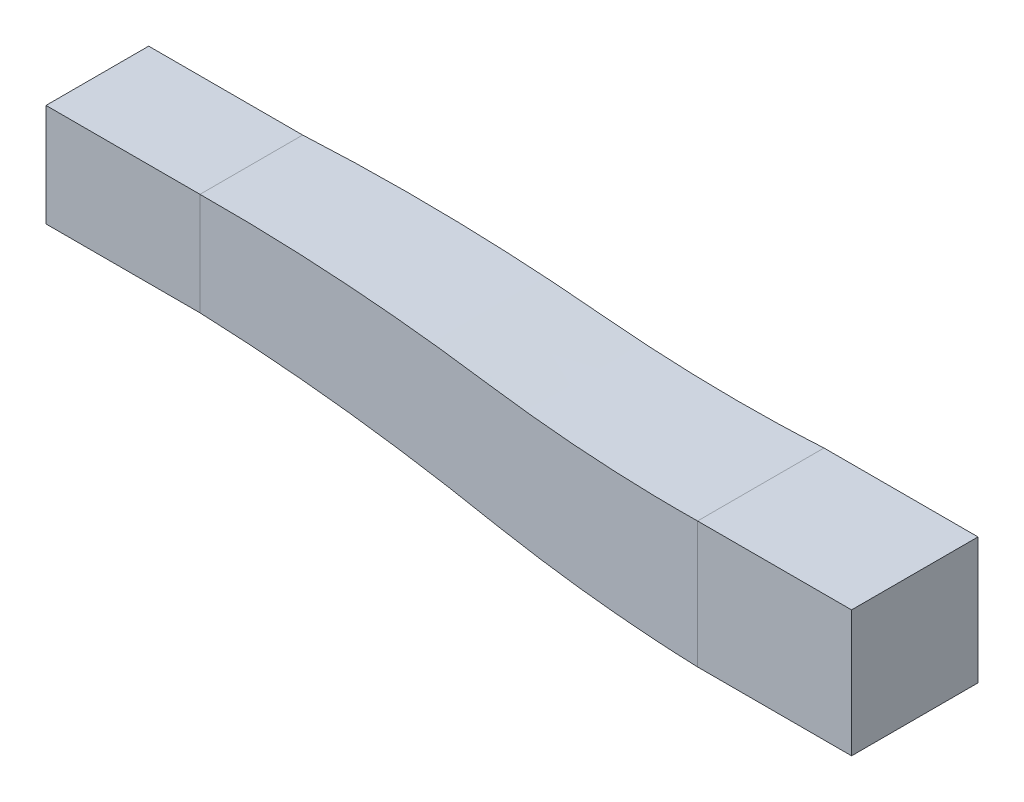
ISO-10303-21;
HEADER;
FILE_DESCRIPTION(('STEP AP214'),'2;1');
FILE_NAME('part.step','',(''),(''),'','','');
FILE_SCHEMA(('AUTOMOTIVE_DESIGN { 1 0 10303 214 1 1 1 1 }'));
ENDSEC;
DATA;
#1=APPLICATION_CONTEXT('core data for automotive mechanical design processes');
#2=APPLICATION_PROTOCOL_DEFINITION('international standard','automotive_design',2000,#1);
#3=PRODUCT_CONTEXT('',#1,'mechanical');
#4=PRODUCT('Part','Part','',(#3));
#5=PRODUCT_RELATED_PRODUCT_CATEGORY('part','',(#4));
#6=PRODUCT_DEFINITION_FORMATION('','',#4);
#7=PRODUCT_DEFINITION_CONTEXT('part definition',#1,'design');
#8=PRODUCT_DEFINITION('design','',#6,#7);
#9=PRODUCT_DEFINITION_SHAPE('','',#8);
#10=(LENGTH_UNIT() NAMED_UNIT(*) SI_UNIT(.MILLI.,.METRE.));
#11=(NAMED_UNIT(*) PLANE_ANGLE_UNIT() SI_UNIT($,.RADIAN.));
#12=(NAMED_UNIT(*) SI_UNIT($,.STERADIAN.) SOLID_ANGLE_UNIT());
#13=UNCERTAINTY_MEASURE_WITH_UNIT(LENGTH_MEASURE(1.E-05),#10,'distance_accuracy_value','');
#14=(GEOMETRIC_REPRESENTATION_CONTEXT(3) GLOBAL_UNCERTAINTY_ASSIGNED_CONTEXT((#13)) GLOBAL_UNIT_ASSIGNED_CONTEXT((#10,
#11,#12)) REPRESENTATION_CONTEXT('',''));
#15=CARTESIAN_POINT('',(0.,0.,0.));
#16=DIRECTION('',(0.,0.,1.));
#17=DIRECTION('',(1.,0.,0.));
#18=AXIS2_PLACEMENT_3D('',#15,#16,#17);
#19=CARTESIAN_POINT('',(0.,102.108,-102.108));
#20=CARTESIAN_POINT('',(193.877836208573,108.126077032337,-106.618479591121));
#21=CARTESIAN_POINT('',(387.852255577892,99.4678581753207,-111.128959182242));
#22=CARTESIAN_POINT('',(724.025214907135,58.8494170592293,-119.002959182242));
#23=CARTESIAN_POINT('',(868.712821410133,52.7250903488197,-122.366479591121));
#24=CARTESIAN_POINT('',(1013.26771114708,57.8788888677979,-125.73));
#25=CARTESIAN_POINT('',(0.,102.108,-93.599));
#26=CARTESIAN_POINT('',(193.877836208573,108.126077032337,-97.733606291861));
#27=CARTESIAN_POINT('',(387.852255577892,99.4678581753207,-101.868212583722));
#28=CARTESIAN_POINT('',(724.025214907135,58.8494170592293,-109.086045917055));
#29=CARTESIAN_POINT('',(868.712821410133,52.7250903488197,-112.169272958528));
#30=CARTESIAN_POINT('',(1013.26771114708,57.8788888677979,-115.2525));
#31=CARTESIAN_POINT('',(0.,102.108,-76.581));
#32=CARTESIAN_POINT('',(193.877836208574,108.126077032337,-79.9638596933409));
#33=CARTESIAN_POINT('',(387.852255577893,99.4678581753207,-83.3467193866817));
#34=CARTESIAN_POINT('',(724.025214907136,58.8494170592293,-89.2522193866817));
#35=CARTESIAN_POINT('',(868.712821410134,52.7250903488197,-91.7748596933409));
#36=CARTESIAN_POINT('',(1013.26771114708,57.8788888677979,-94.2975));
#37=CARTESIAN_POINT('',(0.,102.108,-51.054));
#38=CARTESIAN_POINT('',(193.877836208573,108.126077032337,-53.3092397955606));
#39=CARTESIAN_POINT('',(387.852255577891,99.4678581753207,-55.5644795911211));
#40=CARTESIAN_POINT('',(724.025214907134,58.8494170592293,-59.5014795911212));
#41=CARTESIAN_POINT('',(868.712821410132,52.7250903488196,-61.1832397955606));
#42=CARTESIAN_POINT('',(1013.26771114708,57.8788888677978,-62.865));
#43=CARTESIAN_POINT('',(0.,102.108,-25.527));
#44=CARTESIAN_POINT('',(193.877836208573,108.126077032337,-26.6546198977803));
#45=CARTESIAN_POINT('',(387.852255577892,99.4678581753206,-27.7822397955606));
#46=CARTESIAN_POINT('',(724.025214907135,58.8494170592293,-29.7507397955606));
#47=CARTESIAN_POINT('',(868.712821410134,52.7250903488197,-30.5916198977803));
#48=CARTESIAN_POINT('',(1013.26771114708,57.8788888677979,-31.4325));
#49=CARTESIAN_POINT('',(0.,102.108,-8.509));
#50=CARTESIAN_POINT('',(193.877836208573,108.126077032337,-8.88487329926009));
#51=CARTESIAN_POINT('',(387.852255577892,99.4678581753207,-9.26074659852019));
#52=CARTESIAN_POINT('',(724.025214907135,58.8494170592293,-9.91691326518686));
#53=CARTESIAN_POINT('',(868.712821410133,52.7250903488197,-10.1972066325934));
#54=CARTESIAN_POINT('',(1013.26771114708,57.8788888677979,-10.4775));
#55=CARTESIAN_POINT('',(0.,102.108,8.509));
#56=CARTESIAN_POINT('',(193.877836208573,108.126077032337,8.88487329926009));
#57=CARTESIAN_POINT('',(387.852255577892,99.4678581753207,9.26074659852019));
#58=CARTESIAN_POINT('',(724.025214907135,58.8494170592293,9.91691326518686));
#59=CARTESIAN_POINT('',(868.712821410133,52.7250903488197,10.1972066325934));
#60=CARTESIAN_POINT('',(1013.26771114708,57.8788888677979,10.4775));
#61=CARTESIAN_POINT('',(0.,102.108,25.5270000000001));
#62=CARTESIAN_POINT('',(193.877836208573,108.126077032337,26.6546198977803));
#63=CARTESIAN_POINT('',(387.852255577892,99.4678581753207,27.7822397955606));
#64=CARTESIAN_POINT('',(724.025214907135,58.8494170592293,29.7507397955606));
#65=CARTESIAN_POINT('',(868.712821410134,52.7250903488197,30.5916198977803));
#66=CARTESIAN_POINT('',(1013.26771114708,57.8788888677979,31.4325));
#67=CARTESIAN_POINT('',(0.,102.108,51.0539999999999));
#68=CARTESIAN_POINT('',(193.877836208573,108.126077032337,53.3092397955605));
#69=CARTESIAN_POINT('',(387.852255577892,99.4678581753206,55.5644795911211));
#70=CARTESIAN_POINT('',(724.025214907134,58.8494170592292,59.5014795911211));
#71=CARTESIAN_POINT('',(868.712821410133,52.7250903488196,61.1832397955605));
#72=CARTESIAN_POINT('',(1013.26771114708,57.8788888677978,62.865));
#73=CARTESIAN_POINT('',(0.,102.108,76.5810000000001));
#74=CARTESIAN_POINT('',(193.877836208573,108.126077032337,79.9638596933409));
#75=CARTESIAN_POINT('',(387.852255577892,99.4678581753207,83.3467193866818));
#76=CARTESIAN_POINT('',(724.025214907135,58.8494170592293,89.2522193866818));
#77=CARTESIAN_POINT('',(868.712821410133,52.7250903488197,91.7748596933409));
#78=CARTESIAN_POINT('',(1013.26771114708,57.8788888677979,94.2975000000001));
#79=CARTESIAN_POINT('',(0.,102.108,93.599));
#80=CARTESIAN_POINT('',(193.877836208573,108.126077032337,97.733606291861));
#81=CARTESIAN_POINT('',(387.852255577892,99.4678581753206,101.868212583722));
#82=CARTESIAN_POINT('',(724.025214907135,58.8494170592293,109.086045917055));
#83=CARTESIAN_POINT('',(868.712821410133,52.7250903488196,112.169272958528));
#84=CARTESIAN_POINT('',(1013.26771114708,57.8788888677978,115.2525));
#85=CARTESIAN_POINT('',(0.,102.108,102.108));
#86=CARTESIAN_POINT('',(193.877836208573,108.126077032337,106.618479591121));
#87=CARTESIAN_POINT('',(387.852255577892,99.4678581753206,111.128959182242));
#88=CARTESIAN_POINT('',(724.025214907135,58.8494170592293,119.002959182242));
#89=CARTESIAN_POINT('',(868.712821410133,52.7250903488196,122.366479591121));
#90=CARTESIAN_POINT('',(1013.26771114708,57.8788888677978,125.73));
#91=B_SPLINE_SURFACE_WITH_KNOTS('',3,3,((#19,#20,#21,#22,#23,#24),(#25,#26,#27,#28,#29,#30),
(#31,#32,#33,#34,#35,#36),(#37,#38,#39,#40,#41,#42),(#43,#44,#45,#46,#47,#48),(#49,#50,#51,#52,
#53,#54),(#55,#56,#57,#58,#59,#60),(#61,#62,#63,#64,#65,#66),(#67,#68,#69,#70,#71,#72),(#73,#74,
#75,#76,#77,#78),(#79,#80,#81,#82,#83,#84),(#85,#86,#87,#88,#89,#90)),.UNSPECIFIED.,.F.,.F.,.F.,
(4,1,1,1,2,1,1,1,4),(4,2,4),(0.75,0.78125,0.8125,0.84375,0.875,0.90625,0.9375,0.96875,1.),(0.,
0.572832053736493,1.),.UNSPECIFIED.);
#92=DIRECTION('',(0.,0.,1.));
#93=VECTOR('',#92,1.);
#94=CARTESIAN_POINT('',(0.,102.108,102.108));
#95=LINE('',#94,#93);
#96=CARTESIAN_POINT('',(0.,102.108,-102.108));
#97=VERTEX_POINT('',#96);
#98=CARTESIAN_POINT('',(0.,102.108,102.108));
#99=VERTEX_POINT('',#98);
#100=EDGE_CURVE('E329',#97,#99,#95,.T.);
#101=CARTESIAN_POINT('',(0.,102.108,102.108));
#102=CARTESIAN_POINT('',(193.877836208573,108.126077032337,106.618479591121));
#103=CARTESIAN_POINT('',(387.852255577892,99.4678581753206,111.128959182242));
#104=CARTESIAN_POINT('',(724.025214907135,58.8494170592293,119.002959182242));
#105=CARTESIAN_POINT('',(868.712821410133,52.7250903488196,122.366479591121));
#106=CARTESIAN_POINT('',(1013.26771114708,57.8788888677978,125.73));
#107=B_SPLINE_CURVE_WITH_KNOTS('',3,(#101,#102,#103,#104,#105,#106),.UNSPECIFIED.,.F.,.F.,(4,2,
4),(0.,0.572832053736493,1.),.UNSPECIFIED.);
#108=CARTESIAN_POINT('',(1013.26771114708,57.8788888677978,125.73));
#109=VERTEX_POINT('',#108);
#110=EDGE_CURVE('E331',#99,#109,#107,.T.);
#111=DIRECTION('',(0.,0.,1.));
#112=VECTOR('',#111,1.);
#113=CARTESIAN_POINT('',(1013.26771114708,57.8788888677978,125.73));
#114=LINE('',#113,#112);
#115=CARTESIAN_POINT('',(1013.26771114708,57.8788888677979,-125.73));
#116=VERTEX_POINT('',#115);
#117=EDGE_CURVE('E220',#116,#109,#114,.T.);
#118=CARTESIAN_POINT('',(0.,102.108,-102.108));
#119=CARTESIAN_POINT('',(193.877836208573,108.126077032337,-106.618479591121));
#120=CARTESIAN_POINT('',(387.852255577892,99.4678581753207,-111.128959182242));
#121=CARTESIAN_POINT('',(724.025214907135,58.8494170592293,-119.002959182242));
#122=CARTESIAN_POINT('',(868.712821410133,52.7250903488197,-122.366479591121));
#123=CARTESIAN_POINT('',(1013.26771114708,57.8788888677979,-125.73));
#124=B_SPLINE_CURVE_WITH_KNOTS('',3,(#118,#119,#120,#121,#122,#123),.UNSPECIFIED.,.F.,.F.,(4,2,
4),(0.,0.572832053736493,1.),.UNSPECIFIED.);
#125=EDGE_CURVE('E333',#97,#116,#124,.T.);
#126=ORIENTED_EDGE('',*,*,#100,.T.);
#127=ORIENTED_EDGE('',*,*,#110,.T.);
#128=ORIENTED_EDGE('',*,*,#117,.F.);
#129=ORIENTED_EDGE('',*,*,#125,.F.);
#130=EDGE_LOOP('',(#126,#127,#128,#129));
#131=FACE_BOUND('',#130,.T.);
#132=ADVANCED_FACE('F115',(#131),#91,.T.);
#133=CARTESIAN_POINT('',(0.,-102.108,-102.108));
#134=CARTESIAN_POINT('',(193.877836208573,-105.110882149905,-106.618479591121));
#135=CARTESIAN_POINT('',(387.852255577892,-122.790060189164,-111.128959182242));
#136=CARTESIAN_POINT('',(724.025214907135,-179.156501305255,-119.002959182242));
#137=CARTESIAN_POINT('',(868.712821410133,-192.007868833423,-122.366479591121));
#138=CARTESIAN_POINT('',(1013.26771114708,-193.581111132202,-125.73));
#139=CARTESIAN_POINT('',(0.,-85.0899999999999,-102.108));
#140=CARTESIAN_POINT('',(193.877836208573,-87.3411355513852,-106.618479591121));
#141=CARTESIAN_POINT('',(387.852255577892,-104.268566992124,-111.128959182242));
#142=CARTESIAN_POINT('',(724.025214907135,-159.322674774882,-119.002959182242));
#143=CARTESIAN_POINT('',(868.712821410133,-171.613455568236,-122.366479591121));
#144=CARTESIAN_POINT('',(1013.26771114708,-172.626111132202,-125.73));
#145=CARTESIAN_POINT('',(0.,-51.054,-102.108));
#146=CARTESIAN_POINT('',(193.877836208574,-51.8016423543448,-106.618479591121));
#147=CARTESIAN_POINT('',(387.852255577893,-67.2255805980427,-111.128959182242));
#148=CARTESIAN_POINT('',(724.025214907136,-119.655021714134,-119.002959182242));
#149=CARTESIAN_POINT('',(868.712821410134,-130.824629037862,-122.366479591121));
#150=CARTESIAN_POINT('',(1013.26771114708,-130.716111132202,-125.73));
#151=CARTESIAN_POINT('',(0.,0.,-102.108));
#152=CARTESIAN_POINT('',(193.877836208573,1.50759744121576,-106.618479591121));
#153=CARTESIAN_POINT('',(387.852255577891,-11.6611010069216,-111.128959182242));
#154=CARTESIAN_POINT('',(724.025214907134,-60.153542123013,-119.002959182242));
#155=CARTESIAN_POINT('',(868.712821410132,-69.6413892423016,-122.366479591121));
#156=CARTESIAN_POINT('',(1013.26771114708,-67.8511111322022,-125.73));
#157=CARTESIAN_POINT('',(0.,51.0540000000001,-102.108));
#158=CARTESIAN_POINT('',(193.877836208573,54.8168372367764,-106.618479591121));
#159=CARTESIAN_POINT('',(387.852255577892,43.9033785841996,-111.128959182242));
#160=CARTESIAN_POINT('',(724.025214907135,-0.652062531891758,-119.002959182242));
#161=CARTESIAN_POINT('',(868.712821410134,-8.45814944674081,-122.366479591121));
#162=CARTESIAN_POINT('',(1013.26771114708,-4.98611113220202,-125.73));
#163=CARTESIAN_POINT('',(0.,85.09,-102.108));
#164=CARTESIAN_POINT('',(193.877836208573,90.3563304338167,-106.618479591121));
#165=CARTESIAN_POINT('',(387.852255577892,80.9463649782803,-111.128959182242));
#166=CARTESIAN_POINT('',(724.025214907135,39.0155905288556,-119.002959182242));
#167=CARTESIAN_POINT('',(868.712821410133,32.3306770836328,-122.366479591121));
#168=CARTESIAN_POINT('',(1013.26771114708,36.9238888677979,-125.73));
#169=CARTESIAN_POINT('',(0.,102.108,-102.108));
#170=CARTESIAN_POINT('',(193.877836208573,108.126077032337,-106.618479591121));
#171=CARTESIAN_POINT('',(387.852255577892,99.4678581753207,-111.128959182242));
#172=CARTESIAN_POINT('',(724.025214907135,58.8494170592293,-119.002959182242));
#173=CARTESIAN_POINT('',(868.712821410133,52.7250903488197,-122.366479591121));
#174=CARTESIAN_POINT('',(1013.26771114708,57.8788888677979,-125.73));
#175=B_SPLINE_SURFACE_WITH_KNOTS('',3,3,((#133,#134,#135,#136,#137,#138),(#139,#140,#141,#142,
#143,#144),(#145,#146,#147,#148,#149,#150),(#151,#152,#153,#154,#155,#156),(#157,#158,#159,#160,
#161,#162),(#163,#164,#165,#166,#167,#168),(#169,#170,#171,#172,#173,#174)),.UNSPECIFIED.,.F.,
.F.,.F.,(4,1,1,1,4),(4,2,4),(0.5,0.5625,0.625,0.6875,0.75),(0.,0.572832053736493,1.),.UNSPECIFIED.);
#176=DIRECTION('',(0.,1.,0.));
#177=VECTOR('',#176,1.);
#178=CARTESIAN_POINT('',(0.,102.108,-102.108));
#179=LINE('',#178,#177);
#180=CARTESIAN_POINT('',(0.,-102.108,-102.108));
#181=VERTEX_POINT('',#180);
#182=EDGE_CURVE('E275',#181,#97,#179,.T.);
#183=DIRECTION('',(0.,1.,0.));
#184=VECTOR('',#183,1.);
#185=CARTESIAN_POINT('',(1013.26771114708,-193.581111132202,-125.73));
#186=LINE('',#185,#184);
#187=CARTESIAN_POINT('',(1013.26771114708,-193.581111132202,-125.73));
#188=VERTEX_POINT('',#187);
#189=EDGE_CURVE('E121',#188,#116,#186,.T.);
#190=CARTESIAN_POINT('',(0.,-102.108,-102.108));
#191=CARTESIAN_POINT('',(193.877836208573,-105.110882149905,-106.618479591121));
#192=CARTESIAN_POINT('',(387.852255577892,-122.790060189164,-111.128959182242));
#193=CARTESIAN_POINT('',(724.025214907135,-179.156501305255,-119.002959182242));
#194=CARTESIAN_POINT('',(868.712821410133,-192.007868833423,-122.366479591121));
#195=CARTESIAN_POINT('',(1013.26771114708,-193.581111132202,-125.73));
#196=B_SPLINE_CURVE_WITH_KNOTS('',3,(#190,#191,#192,#193,#194,#195),.UNSPECIFIED.,.F.,.F.,(4,2,
4),(0.,0.572832053736493,1.),.UNSPECIFIED.);
#197=EDGE_CURVE('E352',#181,#188,#196,.T.);
#198=ORIENTED_EDGE('',*,*,#182,.T.);
#199=ORIENTED_EDGE('',*,*,#125,.T.);
#200=ORIENTED_EDGE('',*,*,#189,.F.);
#201=ORIENTED_EDGE('',*,*,#197,.F.);
#202=EDGE_LOOP('',(#198,#199,#200,#201));
#203=FACE_BOUND('',#202,.T.);
#204=ADVANCED_FACE('F319',(#203),#175,.T.);
#205=CARTESIAN_POINT('',(0.,-102.108,102.108));
#206=CARTESIAN_POINT('',(193.877836208573,-105.110882149905,106.618479591121));
#207=CARTESIAN_POINT('',(387.852255577892,-122.790060189164,111.128959182242));
#208=CARTESIAN_POINT('',(724.025214907135,-179.156501305255,119.002959182242));
#209=CARTESIAN_POINT('',(868.712821410133,-192.007868833423,122.366479591121));
#210=CARTESIAN_POINT('',(1013.26771114708,-193.581111132202,125.73));
#211=CARTESIAN_POINT('',(0.,-102.108,85.0899999999999));
#212=CARTESIAN_POINT('',(193.877836208573,-105.110882149905,88.8487329926009));
#213=CARTESIAN_POINT('',(387.852255577892,-122.790060189164,92.6074659852018));
#214=CARTESIAN_POINT('',(724.025214907135,-179.156501305255,99.1691326518685));
#215=CARTESIAN_POINT('',(868.712821410133,-192.007868833423,101.972066325934));
#216=CARTESIAN_POINT('',(1013.26771114708,-193.581111132202,104.775));
#217=CARTESIAN_POINT('',(0.,-102.108,51.054));
#218=CARTESIAN_POINT('',(193.877836208574,-105.110882149905,53.3092397955605));
#219=CARTESIAN_POINT('',(387.852255577893,-122.790060189164,55.5644795911211));
#220=CARTESIAN_POINT('',(724.025214907136,-179.156501305255,59.5014795911211));
#221=CARTESIAN_POINT('',(868.712821410134,-192.007868833423,61.1832397955605));
#222=CARTESIAN_POINT('',(1013.26771114708,-193.581111132202,62.865));
#223=CARTESIAN_POINT('',(0.,-102.108,0.));
#224=CARTESIAN_POINT('',(193.877836208573,-105.110882149905,0.));
#225=CARTESIAN_POINT('',(387.852255577891,-122.790060189164,0.));
#226=CARTESIAN_POINT('',(724.025214907134,-179.156501305255,0.));
#227=CARTESIAN_POINT('',(868.712821410132,-192.007868833423,0.));
#228=CARTESIAN_POINT('',(1013.26771114708,-193.581111132202,0.));
#229=CARTESIAN_POINT('',(0.,-102.108,-51.0540000000001));
#230=CARTESIAN_POINT('',(193.877836208573,-105.110882149905,-53.3092397955606));
#231=CARTESIAN_POINT('',(387.852255577892,-122.790060189164,-55.5644795911212));
#232=CARTESIAN_POINT('',(724.025214907135,-179.156501305255,-59.5014795911212));
#233=CARTESIAN_POINT('',(868.712821410134,-192.007868833423,-61.1832397955607));
#234=CARTESIAN_POINT('',(1013.26771114708,-193.581111132202,-62.8650000000001));
#235=CARTESIAN_POINT('',(0.,-102.108,-85.0900000000001));
#236=CARTESIAN_POINT('',(193.877836208573,-105.110882149905,-88.848732992601));
#237=CARTESIAN_POINT('',(387.852255577892,-122.790060189164,-92.607465985202));
#238=CARTESIAN_POINT('',(724.025214907135,-179.156501305255,-99.1691326518686));
#239=CARTESIAN_POINT('',(868.712821410133,-192.007868833423,-101.972066325934));
#240=CARTESIAN_POINT('',(1013.26771114708,-193.581111132202,-104.775));
#241=CARTESIAN_POINT('',(0.,-102.108,-102.108));
#242=CARTESIAN_POINT('',(193.877836208573,-105.110882149905,-106.618479591121));
#243=CARTESIAN_POINT('',(387.852255577892,-122.790060189164,-111.128959182242));
#244=CARTESIAN_POINT('',(724.025214907135,-179.156501305255,-119.002959182242));
#245=CARTESIAN_POINT('',(868.712821410133,-192.007868833423,-122.366479591121));
#246=CARTESIAN_POINT('',(1013.26771114708,-193.581111132202,-125.73));
#247=B_SPLINE_SURFACE_WITH_KNOTS('',3,3,((#205,#206,#207,#208,#209,#210),(#211,#212,#213,#214,
#215,#216),(#217,#218,#219,#220,#221,#222),(#223,#224,#225,#226,#227,#228),(#229,#230,#231,#232,
#233,#234),(#235,#236,#237,#238,#239,#240),(#241,#242,#243,#244,#245,#246)),.UNSPECIFIED.,.F.,
.F.,.F.,(4,1,1,1,4),(4,2,4),(0.25,0.3125,0.375,0.4375,0.5),(0.,0.572832053736493,1.),.UNSPECIFIED.);
#248=DIRECTION('',(0.,0.,-1.));
#249=VECTOR('',#248,1.);
#250=CARTESIAN_POINT('',(0.,-102.108,-102.108));
#251=LINE('',#250,#249);
#252=CARTESIAN_POINT('',(0.,-102.108,102.108));
#253=VERTEX_POINT('',#252);
#254=EDGE_CURVE('E270',#253,#181,#251,.T.);
#255=DIRECTION('',(0.,0.,-1.));
#256=VECTOR('',#255,1.);
#257=CARTESIAN_POINT('',(1013.26771114708,-193.581111132202,125.73));
#258=LINE('',#257,#256);
#259=CARTESIAN_POINT('',(1013.26771114708,-193.581111132202,125.73));
#260=VERTEX_POINT('',#259);
#261=EDGE_CURVE('E13',#260,#188,#258,.T.);
#262=CARTESIAN_POINT('',(0.,-102.108,102.108));
#263=CARTESIAN_POINT('',(193.877836208573,-105.110882149905,106.618479591121));
#264=CARTESIAN_POINT('',(387.852255577892,-122.790060189164,111.128959182242));
#265=CARTESIAN_POINT('',(724.025214907135,-179.156501305255,119.002959182242));
#266=CARTESIAN_POINT('',(868.712821410133,-192.007868833423,122.366479591121));
#267=CARTESIAN_POINT('',(1013.26771114708,-193.581111132202,125.73));
#268=B_SPLINE_CURVE_WITH_KNOTS('',3,(#262,#263,#264,#265,#266,#267),.UNSPECIFIED.,.F.,.F.,(4,2,
4),(0.,0.572832053736493,1.),.UNSPECIFIED.);
#269=EDGE_CURVE('E135',#253,#260,#268,.T.);
#270=ORIENTED_EDGE('',*,*,#254,.T.);
#271=ORIENTED_EDGE('',*,*,#197,.T.);
#272=ORIENTED_EDGE('',*,*,#261,.F.);
#273=ORIENTED_EDGE('',*,*,#269,.F.);
#274=EDGE_LOOP('',(#270,#271,#272,#273));
#275=FACE_BOUND('',#274,.T.);
#276=ADVANCED_FACE('F324',(#275),#247,.T.);
#277=CARTESIAN_POINT('',(0.,102.108,102.108));
#278=CARTESIAN_POINT('',(193.877836208573,108.126077032337,106.618479591121));
#279=CARTESIAN_POINT('',(387.852255577892,99.4678581753206,111.128959182242));
#280=CARTESIAN_POINT('',(724.025214907135,58.8494170592293,119.002959182242));
#281=CARTESIAN_POINT('',(868.712821410133,52.7250903488196,122.366479591121));
#282=CARTESIAN_POINT('',(1013.26771114708,57.8788888677978,125.73));
#283=CARTESIAN_POINT('',(0.,85.09,102.108));
#284=CARTESIAN_POINT('',(193.877836208573,90.3563304338167,106.618479591121));
#285=CARTESIAN_POINT('',(387.852255577892,80.9463649782803,111.128959182242));
#286=CARTESIAN_POINT('',(724.025214907135,39.0155905288555,119.002959182242));
#287=CARTESIAN_POINT('',(868.712821410133,32.3306770836328,122.366479591121));
#288=CARTESIAN_POINT('',(1013.26771114708,36.9238888677978,125.73));
#289=CARTESIAN_POINT('',(0.,51.054,102.108));
#290=CARTESIAN_POINT('',(193.877836208574,54.8168372367763,106.618479591121));
#291=CARTESIAN_POINT('',(387.852255577893,43.9033785841994,111.128959182242));
#292=CARTESIAN_POINT('',(724.025214907136,-0.652062531891984,119.002959182242));
#293=CARTESIAN_POINT('',(868.712821410134,-8.45814944674107,122.366479591121));
#294=CARTESIAN_POINT('',(1013.26771114708,-4.98611113220231,125.73));
#295=CARTESIAN_POINT('',(0.,0.,102.108));
#296=CARTESIAN_POINT('',(193.877836208573,1.50759744121577,106.618479591121));
#297=CARTESIAN_POINT('',(387.852255577891,-11.6611010069216,111.128959182242));
#298=CARTESIAN_POINT('',(724.025214907134,-60.1535421230129,119.002959182242));
#299=CARTESIAN_POINT('',(868.712821410132,-69.6413892423013,122.366479591121));
#300=CARTESIAN_POINT('',(1013.26771114708,-67.851111132202,125.73));
#301=CARTESIAN_POINT('',(0.,-51.054,102.108));
#302=CARTESIAN_POINT('',(193.877836208573,-51.8016423543449,106.618479591121));
#303=CARTESIAN_POINT('',(387.852255577892,-67.2255805980429,111.128959182242));
#304=CARTESIAN_POINT('',(724.025214907135,-119.655021714134,119.002959182242));
#305=CARTESIAN_POINT('',(868.712821410134,-130.824629037862,122.366479591121));
#306=CARTESIAN_POINT('',(1013.26771114708,-130.716111132202,125.73));
#307=CARTESIAN_POINT('',(0.,-85.09,102.108));
#308=CARTESIAN_POINT('',(193.877836208573,-87.3411355513852,106.618479591121));
#309=CARTESIAN_POINT('',(387.852255577892,-104.268566992124,111.128959182242));
#310=CARTESIAN_POINT('',(724.025214907135,-159.322674774882,119.002959182242));
#311=CARTESIAN_POINT('',(868.712821410133,-171.613455568236,122.366479591121));
#312=CARTESIAN_POINT('',(1013.26771114708,-172.626111132202,125.73));
#313=CARTESIAN_POINT('',(0.,-102.108,102.108));
#314=CARTESIAN_POINT('',(193.877836208573,-105.110882149905,106.618479591121));
#315=CARTESIAN_POINT('',(387.852255577892,-122.790060189164,111.128959182242));
#316=CARTESIAN_POINT('',(724.025214907135,-179.156501305255,119.002959182242));
#317=CARTESIAN_POINT('',(868.712821410133,-192.007868833423,122.366479591121));
#318=CARTESIAN_POINT('',(1013.26771114708,-193.581111132202,125.73));
#319=B_SPLINE_SURFACE_WITH_KNOTS('',3,3,((#277,#278,#279,#280,#281,#282),(#283,#284,#285,#286,
#287,#288),(#289,#290,#291,#292,#293,#294),(#295,#296,#297,#298,#299,#300),(#301,#302,#303,#304,
#305,#306),(#307,#308,#309,#310,#311,#312),(#313,#314,#315,#316,#317,#318)),.UNSPECIFIED.,.F.,
.F.,.F.,(4,1,1,1,4),(4,2,4),(0.,0.0625,0.125,0.1875,0.25),(0.,0.572832053736493,1.),.UNSPECIFIED.);
#320=DIRECTION('',(0.,-1.,0.));
#321=VECTOR('',#320,1.);
#322=CARTESIAN_POINT('',(0.,-102.108,102.108));
#323=LINE('',#322,#321);
#324=EDGE_CURVE('E274',#99,#253,#323,.T.);
#325=DIRECTION('',(0.,-1.,0.));
#326=VECTOR('',#325,1.);
#327=CARTESIAN_POINT('',(1013.26771114708,57.8788888677978,125.73));
#328=LINE('',#327,#326);
#329=EDGE_CURVE('E127',#109,#260,#328,.T.);
#330=ORIENTED_EDGE('',*,*,#324,.T.);
#331=ORIENTED_EDGE('',*,*,#269,.T.);
#332=ORIENTED_EDGE('',*,*,#329,.F.);
#333=ORIENTED_EDGE('',*,*,#110,.F.);
#334=EDGE_LOOP('',(#330,#331,#332,#333));
#335=FACE_BOUND('',#334,.T.);
#336=ADVANCED_FACE('F374',(#335),#319,.T.);
#337=CARTESIAN_POINT('',(-306.324,102.108,-102.108));
#338=DIRECTION('',(0.,0.,-1.));
#339=DIRECTION('',(0.,1.,0.));
#340=AXIS2_PLACEMENT_3D('',#337,#338,#339);
#341=PLANE('',#340);
#342=ORIENTED_EDGE('',*,*,#182,.F.);
#343=DIRECTION('',(1.,0.,0.));
#344=VECTOR('',#343,1.);
#345=CARTESIAN_POINT('',(-306.324,-102.108,-102.108));
#346=LINE('',#345,#344);
#347=CARTESIAN_POINT('',(-306.324,-102.108,-102.108));
#348=VERTEX_POINT('',#347);
#349=EDGE_CURVE('E266',#348,#181,#346,.T.);
#350=ORIENTED_EDGE('',*,*,#349,.F.);
#351=DIRECTION('',(0.,1.,0.));
#352=VECTOR('',#351,1.);
#353=CARTESIAN_POINT('',(-306.324,102.108,-102.108));
#354=LINE('',#353,#352);
#355=CARTESIAN_POINT('',(-306.324,102.108,-102.108));
#356=VERTEX_POINT('',#355);
#357=EDGE_CURVE('E211',#348,#356,#354,.T.);
#358=ORIENTED_EDGE('',*,*,#357,.T.);
#359=DIRECTION('',(1.,0.,0.));
#360=VECTOR('',#359,1.);
#361=CARTESIAN_POINT('',(-306.324,102.108,-102.108));
#362=LINE('',#361,#360);
#363=EDGE_CURVE('E480',#356,#97,#362,.T.);
#364=ORIENTED_EDGE('',*,*,#363,.T.);
#365=EDGE_LOOP('',(#342,#350,#358,#364));
#366=FACE_BOUND('',#365,.T.);
#367=ADVANCED_FACE('F248',(#366),#341,.T.);
#368=CARTESIAN_POINT('',(-306.324,-102.108,-102.108));
#369=DIRECTION('',(0.,-1.,0.));
#370=DIRECTION('',(0.,0.,-1.));
#371=AXIS2_PLACEMENT_3D('',#368,#369,#370);
#372=PLANE('',#371);
#373=ORIENTED_EDGE('',*,*,#254,.F.);
#374=DIRECTION('',(1.,0.,0.));
#375=VECTOR('',#374,1.);
#376=CARTESIAN_POINT('',(-306.324,-102.108,102.108));
#377=LINE('',#376,#375);
#378=CARTESIAN_POINT('',(-306.324,-102.108,102.108));
#379=VERTEX_POINT('',#378);
#380=EDGE_CURVE('E259',#379,#253,#377,.T.);
#381=ORIENTED_EDGE('',*,*,#380,.F.);
#382=DIRECTION('',(0.,0.,-1.));
#383=VECTOR('',#382,1.);
#384=CARTESIAN_POINT('',(-306.324,-102.108,-102.108));
#385=LINE('',#384,#383);
#386=EDGE_CURVE('E341',#379,#348,#385,.T.);
#387=ORIENTED_EDGE('',*,*,#386,.T.);
#388=ORIENTED_EDGE('',*,*,#349,.T.);
#389=EDGE_LOOP('',(#373,#381,#387,#388));
#390=FACE_BOUND('',#389,.T.);
#391=ADVANCED_FACE('F243',(#390),#372,.T.);
#392=CARTESIAN_POINT('',(-306.324,-102.108,102.108));
#393=DIRECTION('',(0.,0.,1.));
#394=DIRECTION('',(0.,-1.,0.));
#395=AXIS2_PLACEMENT_3D('',#392,#393,#394);
#396=PLANE('',#395);
#397=ORIENTED_EDGE('',*,*,#324,.F.);
#398=DIRECTION('',(1.,0.,0.));
#399=VECTOR('',#398,1.);
#400=CARTESIAN_POINT('',(-306.324,102.108,102.108));
#401=LINE('',#400,#399);
#402=CARTESIAN_POINT('',(-306.324,102.108,102.108));
#403=VERTEX_POINT('',#402);
#404=EDGE_CURVE('E267',#403,#99,#401,.T.);
#405=ORIENTED_EDGE('',*,*,#404,.F.);
#406=DIRECTION('',(0.,-1.,0.));
#407=VECTOR('',#406,1.);
#408=CARTESIAN_POINT('',(-306.324,-102.108,102.108));
#409=LINE('',#408,#407);
#410=EDGE_CURVE('E474',#403,#379,#409,.T.);
#411=ORIENTED_EDGE('',*,*,#410,.T.);
#412=ORIENTED_EDGE('',*,*,#380,.T.);
#413=EDGE_LOOP('',(#397,#405,#411,#412));
#414=FACE_BOUND('',#413,.T.);
#415=ADVANCED_FACE('F247',(#414),#396,.T.);
#416=CARTESIAN_POINT('',(-306.324,102.108,102.108));
#417=DIRECTION('',(0.,1.,0.));
#418=DIRECTION('',(0.,0.,1.));
#419=AXIS2_PLACEMENT_3D('',#416,#417,#418);
#420=PLANE('',#419);
#421=ORIENTED_EDGE('',*,*,#100,.F.);
#422=ORIENTED_EDGE('',*,*,#363,.F.);
#423=DIRECTION('',(0.,0.,1.));
#424=VECTOR('',#423,1.);
#425=CARTESIAN_POINT('',(-306.324,102.108,102.108));
#426=LINE('',#425,#424);
#427=EDGE_CURVE('E214',#356,#403,#426,.T.);
#428=ORIENTED_EDGE('',*,*,#427,.T.);
#429=ORIENTED_EDGE('',*,*,#404,.T.);
#430=EDGE_LOOP('',(#421,#422,#428,#429));
#431=FACE_BOUND('',#430,.T.);
#432=ADVANCED_FACE('F241',(#431),#420,.T.);
#433=CARTESIAN_POINT('',(-306.324,0.,0.));
#434=DIRECTION('',(-1.,0.,0.));
#435=DIRECTION('',(0.,0.,1.));
#436=AXIS2_PLACEMENT_3D('',#433,#434,#435);
#437=PLANE('',#436);
#438=ORIENTED_EDGE('',*,*,#357,.F.);
#439=ORIENTED_EDGE('',*,*,#386,.F.);
#440=ORIENTED_EDGE('',*,*,#410,.F.);
#441=ORIENTED_EDGE('',*,*,#427,.F.);
#442=EDGE_LOOP('',(#438,#439,#440,#441));
#443=FACE_BOUND('',#442,.T.);
#444=ADVANCED_FACE('F236',(#443),#437,.T.);
#445=CARTESIAN_POINT('',(1319.59171114708,-193.581111132202,-125.73));
#446=DIRECTION('',(0.,0.,1.));
#447=DIRECTION('',(0.,-1.,0.));
#448=AXIS2_PLACEMENT_3D('',#445,#446,#447);
#449=PLANE('',#448);
#450=ORIENTED_EDGE('',*,*,#189,.T.);
#451=DIRECTION('',(-1.,0.,0.));
#452=VECTOR('',#451,1.);
#453=CARTESIAN_POINT('',(1319.59171114708,57.8788888677979,-125.73));
#454=LINE('',#453,#452);
#455=CARTESIAN_POINT('',(1319.59171114708,57.8788888677979,-125.73));
#456=VERTEX_POINT('',#455);
#457=EDGE_CURVE('E191',#456,#116,#454,.T.);
#458=ORIENTED_EDGE('',*,*,#457,.F.);
#459=DIRECTION('',(0.,1.,0.));
#460=VECTOR('',#459,1.);
#461=CARTESIAN_POINT('',(1319.59171114708,-193.581111132202,-125.73));
#462=LINE('',#461,#460);
#463=CARTESIAN_POINT('',(1319.59171114708,-193.581111132202,-125.73));
#464=VERTEX_POINT('',#463);
#465=EDGE_CURVE('E198',#464,#456,#462,.T.);
#466=ORIENTED_EDGE('',*,*,#465,.F.);
#467=DIRECTION('',(-1.,0.,0.));
#468=VECTOR('',#467,1.);
#469=CARTESIAN_POINT('',(1319.59171114708,-193.581111132202,-125.73));
#470=LINE('',#469,#468);
#471=EDGE_CURVE('E293',#464,#188,#470,.T.);
#472=ORIENTED_EDGE('',*,*,#471,.T.);
#473=EDGE_LOOP('',(#450,#458,#466,#472));
#474=FACE_BOUND('',#473,.T.);
#475=ADVANCED_FACE('F208',(#474),#449,.F.);
#476=CARTESIAN_POINT('',(1319.59171114708,57.8788888677978,125.73));
#477=DIRECTION('',(0.,-1.,0.));
#478=DIRECTION('',(0.,0.,-1.));
#479=AXIS2_PLACEMENT_3D('',#476,#477,#478);
#480=PLANE('',#479);
#481=ORIENTED_EDGE('',*,*,#117,.T.);
#482=DIRECTION('',(-1.,0.,0.));
#483=VECTOR('',#482,1.);
#484=CARTESIAN_POINT('',(1319.59171114708,57.8788888677978,125.73));
#485=LINE('',#484,#483);
#486=CARTESIAN_POINT('',(1319.59171114708,57.8788888677978,125.73));
#487=VERTEX_POINT('',#486);
#488=EDGE_CURVE('E194',#487,#109,#485,.T.);
#489=ORIENTED_EDGE('',*,*,#488,.F.);
#490=DIRECTION('',(0.,0.,1.));
#491=VECTOR('',#490,1.);
#492=CARTESIAN_POINT('',(1319.59171114708,57.8788888677978,125.73));
#493=LINE('',#492,#491);
#494=EDGE_CURVE('E186',#456,#487,#493,.T.);
#495=ORIENTED_EDGE('',*,*,#494,.F.);
#496=ORIENTED_EDGE('',*,*,#457,.T.);
#497=EDGE_LOOP('',(#481,#489,#495,#496));
#498=FACE_BOUND('',#497,.T.);
#499=ADVANCED_FACE('F189',(#498),#480,.F.);
#500=CARTESIAN_POINT('',(1319.59171114708,57.8788888677978,125.73));
#501=DIRECTION('',(0.,0.,-1.));
#502=DIRECTION('',(0.,1.,0.));
#503=AXIS2_PLACEMENT_3D('',#500,#501,#502);
#504=PLANE('',#503);
#505=ORIENTED_EDGE('',*,*,#329,.T.);
#506=DIRECTION('',(-1.,0.,0.));
#507=VECTOR('',#506,1.);
#508=CARTESIAN_POINT('',(1319.59171114708,-193.581111132202,125.73));
#509=LINE('',#508,#507);
#510=CARTESIAN_POINT('',(1319.59171114708,-193.581111132202,125.73));
#511=VERTEX_POINT('',#510);
#512=EDGE_CURVE('E216',#511,#260,#509,.T.);
#513=ORIENTED_EDGE('',*,*,#512,.F.);
#514=DIRECTION('',(0.,-1.,0.));
#515=VECTOR('',#514,1.);
#516=CARTESIAN_POINT('',(1319.59171114708,57.8788888677978,125.73));
#517=LINE('',#516,#515);
#518=EDGE_CURVE('E197',#487,#511,#517,.T.);
#519=ORIENTED_EDGE('',*,*,#518,.F.);
#520=ORIENTED_EDGE('',*,*,#488,.T.);
#521=EDGE_LOOP('',(#505,#513,#519,#520));
#522=FACE_BOUND('',#521,.T.);
#523=ADVANCED_FACE('F302',(#522),#504,.F.);
#524=CARTESIAN_POINT('',(1319.59171114708,-193.581111132202,125.73));
#525=DIRECTION('',(0.,1.,0.));
#526=DIRECTION('',(0.,0.,1.));
#527=AXIS2_PLACEMENT_3D('',#524,#525,#526);
#528=PLANE('',#527);
#529=ORIENTED_EDGE('',*,*,#261,.T.);
#530=ORIENTED_EDGE('',*,*,#471,.F.);
#531=DIRECTION('',(0.,0.,-1.));
#532=VECTOR('',#531,1.);
#533=CARTESIAN_POINT('',(1319.59171114708,-193.581111132202,125.73));
#534=LINE('',#533,#532);
#535=EDGE_CURVE('E203',#511,#464,#534,.T.);
#536=ORIENTED_EDGE('',*,*,#535,.F.);
#537=ORIENTED_EDGE('',*,*,#512,.T.);
#538=EDGE_LOOP('',(#529,#530,#536,#537));
#539=FACE_BOUND('',#538,.T.);
#540=ADVANCED_FACE('F310',(#539),#528,.F.);
#541=CARTESIAN_POINT('',(1319.59171114708,0.,0.));
#542=DIRECTION('',(-1.,0.,0.));
#543=DIRECTION('',(0.,0.,1.));
#544=AXIS2_PLACEMENT_3D('',#541,#542,#543);
#545=PLANE('',#544);
#546=ORIENTED_EDGE('',*,*,#465,.T.);
#547=ORIENTED_EDGE('',*,*,#494,.T.);
#548=ORIENTED_EDGE('',*,*,#518,.T.);
#549=ORIENTED_EDGE('',*,*,#535,.T.);
#550=EDGE_LOOP('',(#546,#547,#548,#549));
#551=FACE_BOUND('',#550,.T.);
#552=ADVANCED_FACE('F201',(#551),#545,.F.);
#553=CLOSED_SHELL('',(#132,#204,#276,#336,#367,#391,#415,#432,#444,#475,#499,#523,#540,#552));
#554=MANIFOLD_SOLID_BREP('B2',#553);
#555=ADVANCED_BREP_SHAPE_REPRESENTATION('',(#18,#554),#14);
#556=SHAPE_DEFINITION_REPRESENTATION(#9,#555);
ENDSEC;
END-ISO-10303-21;
